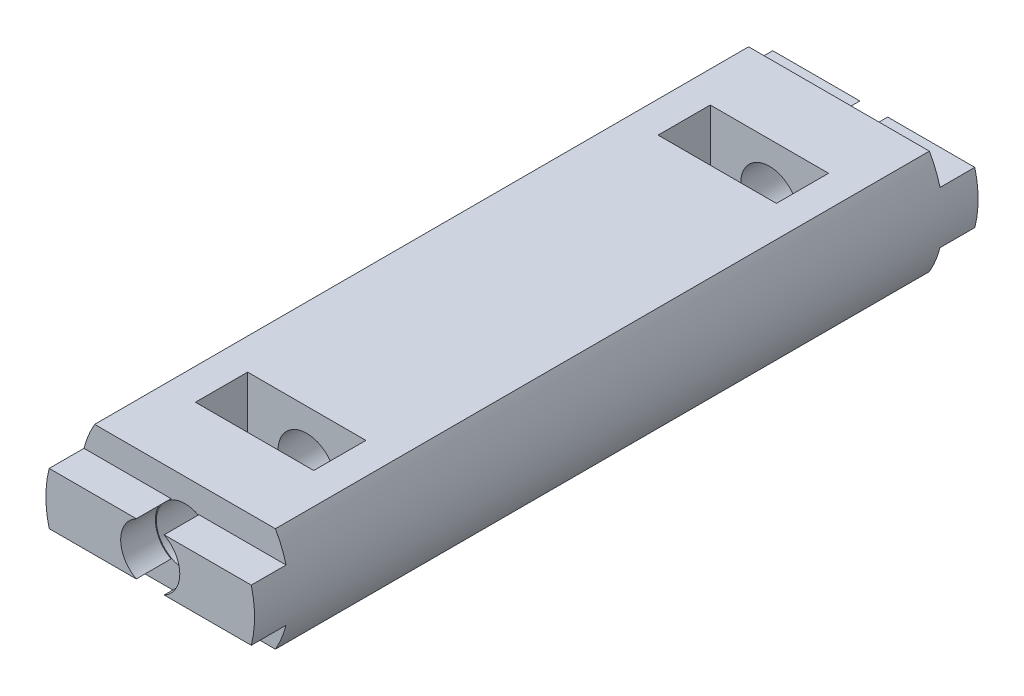
ISO-10303-21;
HEADER;
FILE_DESCRIPTION(('STEP AP214'),'2;1');
FILE_NAME('part.step','',(''),(''),'','','');
FILE_SCHEMA(('AUTOMOTIVE_DESIGN { 1 0 10303 214 1 1 1 1 }'));
ENDSEC;
DATA;
#1=APPLICATION_CONTEXT('core data for automotive mechanical design processes');
#2=APPLICATION_PROTOCOL_DEFINITION('international standard','automotive_design',2000,#1);
#3=PRODUCT_CONTEXT('',#1,'mechanical');
#4=PRODUCT('Part','Part','',(#3));
#5=PRODUCT_RELATED_PRODUCT_CATEGORY('part','',(#4));
#6=PRODUCT_DEFINITION_FORMATION('','',#4);
#7=PRODUCT_DEFINITION_CONTEXT('part definition',#1,'design');
#8=PRODUCT_DEFINITION('design','',#6,#7);
#9=PRODUCT_DEFINITION_SHAPE('','',#8);
#10=(LENGTH_UNIT() NAMED_UNIT(*) SI_UNIT(.MILLI.,.METRE.));
#11=(NAMED_UNIT(*) PLANE_ANGLE_UNIT() SI_UNIT($,.RADIAN.));
#12=(NAMED_UNIT(*) SI_UNIT($,.STERADIAN.) SOLID_ANGLE_UNIT());
#13=UNCERTAINTY_MEASURE_WITH_UNIT(LENGTH_MEASURE(1.E-05),#10,'distance_accuracy_value','');
#14=(GEOMETRIC_REPRESENTATION_CONTEXT(3) GLOBAL_UNCERTAINTY_ASSIGNED_CONTEXT((#13)) GLOBAL_UNIT_ASSIGNED_CONTEXT((#10,
#11,#12)) REPRESENTATION_CONTEXT('',''));
#15=CARTESIAN_POINT('',(0.,0.,0.));
#16=DIRECTION('',(0.,0.,1.));
#17=DIRECTION('',(1.,0.,0.));
#18=AXIS2_PLACEMENT_3D('',#15,#16,#17);
#19=CARTESIAN_POINT('',(-5.19615242270663,3.,37.6));
#20=DIRECTION('',(0.,-1.,0.));
#21=DIRECTION('',(0.,0.,-1.));
#22=AXIS2_PLACEMENT_3D('',#19,#20,#21);
#23=PLANE('',#22);
#24=DIRECTION('',(0.,0.,1.));
#25=VECTOR('',#24,1.);
#26=CARTESIAN_POINT('',(3.4,3.,0.));
#27=LINE('',#26,#25);
#28=CARTESIAN_POINT('',(3.4,3.,4.));
#29=VERTEX_POINT('',#28);
#30=CARTESIAN_POINT('',(3.4,3.,7.));
#31=VERTEX_POINT('',#30);
#32=EDGE_CURVE('E256',#29,#31,#27,.T.);
#33=ORIENTED_EDGE('',*,*,#32,.T.);
#34=DIRECTION('',(1.,0.,0.));
#35=VECTOR('',#34,1.);
#36=CARTESIAN_POINT('',(0.,3.,7.));
#37=LINE('',#36,#35);
#38=CARTESIAN_POINT('',(-3.4,3.,7.));
#39=VERTEX_POINT('',#38);
#40=EDGE_CURVE('E265',#39,#31,#37,.T.);
#41=ORIENTED_EDGE('',*,*,#40,.F.);
#42=DIRECTION('',(0.,0.,1.));
#43=VECTOR('',#42,1.);
#44=CARTESIAN_POINT('',(-3.4,3.,0.));
#45=LINE('',#44,#43);
#46=CARTESIAN_POINT('',(-3.4,3.,4.));
#47=VERTEX_POINT('',#46);
#48=EDGE_CURVE('E262',#47,#39,#45,.T.);
#49=ORIENTED_EDGE('',*,*,#48,.F.);
#50=DIRECTION('',(1.,0.,0.));
#51=VECTOR('',#50,1.);
#52=CARTESIAN_POINT('',(0.,3.,4.));
#53=LINE('',#52,#51);
#54=EDGE_CURVE('E259',#47,#29,#53,.T.);
#55=ORIENTED_EDGE('',*,*,#54,.T.);
#56=EDGE_LOOP('',(#33,#41,#49,#55));
#57=FACE_BOUND('',#56,.T.);
#58=DIRECTION('',(-1.,0.,0.));
#59=VECTOR('',#58,1.);
#60=CARTESIAN_POINT('',(-5.19615242270663,3.,0.));
#61=LINE('',#60,#59);
#62=CARTESIAN_POINT('',(5.19615242270663,3.,0.));
#63=VERTEX_POINT('',#62);
#64=CARTESIAN_POINT('',(-5.19615242270663,3.,0.));
#65=VERTEX_POINT('',#64);
#66=EDGE_CURVE('E416',#63,#65,#61,.T.);
#67=ORIENTED_EDGE('',*,*,#66,.T.);
#68=DIRECTION('',(0.,0.,-1.));
#69=VECTOR('',#68,1.);
#70=CARTESIAN_POINT('',(-5.19615242270663,3.,37.6));
#71=LINE('',#70,#69);
#72=CARTESIAN_POINT('',(-5.19615242270663,3.,37.6));
#73=VERTEX_POINT('',#72);
#74=EDGE_CURVE('E429',#73,#65,#71,.T.);
#75=ORIENTED_EDGE('',*,*,#74,.F.);
#76=DIRECTION('',(-1.,0.,0.));
#77=VECTOR('',#76,1.);
#78=CARTESIAN_POINT('',(-5.19615242270663,3.,37.6));
#79=LINE('',#78,#77);
#80=CARTESIAN_POINT('',(5.19615242270663,3.,37.6));
#81=VERTEX_POINT('',#80);
#82=EDGE_CURVE('E403',#81,#73,#79,.T.);
#83=ORIENTED_EDGE('',*,*,#82,.F.);
#84=DIRECTION('',(0.,0.,-1.));
#85=VECTOR('',#84,1.);
#86=CARTESIAN_POINT('',(5.19615242270663,3.,37.6));
#87=LINE('',#86,#85);
#88=EDGE_CURVE('E432',#81,#63,#87,.T.);
#89=ORIENTED_EDGE('',*,*,#88,.T.);
#90=EDGE_LOOP('',(#67,#75,#83,#89));
#91=FACE_BOUND('',#90,.T.);
#92=DIRECTION('',(0.,0.,-1.));
#93=VECTOR('',#92,1.);
#94=CARTESIAN_POINT('',(-3.39999999999993,3.,0.));
#95=LINE('',#94,#93);
#96=CARTESIAN_POINT('',(-3.4,3.,33.6));
#97=VERTEX_POINT('',#96);
#98=CARTESIAN_POINT('',(-3.39999999999999,3.,30.6));
#99=VERTEX_POINT('',#98);
#100=EDGE_CURVE('E52',#97,#99,#95,.T.);
#101=ORIENTED_EDGE('',*,*,#100,.T.);
#102=DIRECTION('',(-1.,0.,0.));
#103=VECTOR('',#102,1.);
#104=CARTESIAN_POINT('',(0.,3.,30.6));
#105=LINE('',#104,#103);
#106=CARTESIAN_POINT('',(3.4,3.,30.6));
#107=VERTEX_POINT('',#106);
#108=EDGE_CURVE('E238',#107,#99,#105,.T.);
#109=ORIENTED_EDGE('',*,*,#108,.F.);
#110=DIRECTION('',(0.,0.,-1.));
#111=VECTOR('',#110,1.);
#112=CARTESIAN_POINT('',(3.40000000000001,3.,0.));
#113=LINE('',#112,#111);
#114=CARTESIAN_POINT('',(3.4,3.,33.6));
#115=VERTEX_POINT('',#114);
#116=EDGE_CURVE('E225',#115,#107,#113,.T.);
#117=ORIENTED_EDGE('',*,*,#116,.F.);
#118=DIRECTION('',(-1.,0.,0.));
#119=VECTOR('',#118,1.);
#120=CARTESIAN_POINT('',(0.,3.,33.6));
#121=LINE('',#120,#119);
#122=EDGE_CURVE('E233',#115,#97,#121,.T.);
#123=ORIENTED_EDGE('',*,*,#122,.T.);
#124=EDGE_LOOP('',(#101,#109,#117,#123));
#125=FACE_BOUND('',#124,.T.);
#126=ADVANCED_FACE('F35',(#57,#91,#125),#23,.F.);
#127=CARTESIAN_POINT('',(-5.19615242270663,-3.,37.6));
#128=DIRECTION('',(0.,1.,0.));
#129=DIRECTION('',(0.,0.,1.));
#130=AXIS2_PLACEMENT_3D('',#127,#128,#129);
#131=PLANE('',#130);
#132=DIRECTION('',(0.,0.,1.));
#133=VECTOR('',#132,1.);
#134=CARTESIAN_POINT('',(3.4,-3.,0.));
#135=LINE('',#134,#133);
#136=CARTESIAN_POINT('',(3.4,-3.,4.));
#137=VERTEX_POINT('',#136);
#138=CARTESIAN_POINT('',(3.4,-3.,7.));
#139=VERTEX_POINT('',#138);
#140=EDGE_CURVE('E268',#137,#139,#135,.T.);
#141=ORIENTED_EDGE('',*,*,#140,.F.);
#142=DIRECTION('',(1.,0.,0.));
#143=VECTOR('',#142,1.);
#144=CARTESIAN_POINT('',(0.,-3.,4.));
#145=LINE('',#144,#143);
#146=CARTESIAN_POINT('',(-3.4,-3.,4.));
#147=VERTEX_POINT('',#146);
#148=EDGE_CURVE('E270',#147,#137,#145,.T.);
#149=ORIENTED_EDGE('',*,*,#148,.F.);
#150=DIRECTION('',(0.,0.,1.));
#151=VECTOR('',#150,1.);
#152=CARTESIAN_POINT('',(-3.4,-3.,0.));
#153=LINE('',#152,#151);
#154=CARTESIAN_POINT('',(-3.4,-3.,7.));
#155=VERTEX_POINT('',#154);
#156=EDGE_CURVE('E272',#147,#155,#153,.T.);
#157=ORIENTED_EDGE('',*,*,#156,.T.);
#158=DIRECTION('',(1.,0.,0.));
#159=VECTOR('',#158,1.);
#160=CARTESIAN_POINT('',(0.,-3.,7.));
#161=LINE('',#160,#159);
#162=EDGE_CURVE('E275',#155,#139,#161,.T.);
#163=ORIENTED_EDGE('',*,*,#162,.T.);
#164=EDGE_LOOP('',(#141,#149,#157,#163));
#165=FACE_BOUND('',#164,.T.);
#166=DIRECTION('',(1.,0.,0.));
#167=VECTOR('',#166,1.);
#168=CARTESIAN_POINT('',(-5.19615242270663,-3.,0.));
#169=LINE('',#168,#167);
#170=CARTESIAN_POINT('',(-5.19615242270663,-3.,0.));
#171=VERTEX_POINT('',#170);
#172=CARTESIAN_POINT('',(5.19615242270663,-3.,0.));
#173=VERTEX_POINT('',#172);
#174=EDGE_CURVE('E422',#171,#173,#169,.T.);
#175=ORIENTED_EDGE('',*,*,#174,.T.);
#176=DIRECTION('',(0.,0.,-1.));
#177=VECTOR('',#176,1.);
#178=CARTESIAN_POINT('',(5.19615242270663,-3.,37.6));
#179=LINE('',#178,#177);
#180=CARTESIAN_POINT('',(5.19615242270663,-3.,37.6));
#181=VERTEX_POINT('',#180);
#182=EDGE_CURVE('E412',#181,#173,#179,.T.);
#183=ORIENTED_EDGE('',*,*,#182,.F.);
#184=DIRECTION('',(1.,0.,0.));
#185=VECTOR('',#184,1.);
#186=CARTESIAN_POINT('',(-5.19615242270663,-3.,37.6));
#187=LINE('',#186,#185);
#188=CARTESIAN_POINT('',(-5.19615242270663,-3.,37.6));
#189=VERTEX_POINT('',#188);
#190=EDGE_CURVE('E410',#189,#181,#187,.T.);
#191=ORIENTED_EDGE('',*,*,#190,.F.);
#192=DIRECTION('',(0.,0.,-1.));
#193=VECTOR('',#192,1.);
#194=CARTESIAN_POINT('',(-5.19615242270663,-3.,37.6));
#195=LINE('',#194,#193);
#196=EDGE_CURVE('E426',#189,#171,#195,.T.);
#197=ORIENTED_EDGE('',*,*,#196,.T.);
#198=EDGE_LOOP('',(#175,#183,#191,#197));
#199=FACE_BOUND('',#198,.T.);
#200=DIRECTION('',(0.,0.,-1.));
#201=VECTOR('',#200,1.);
#202=CARTESIAN_POINT('',(-3.39999999999993,-3.,0.));
#203=LINE('',#202,#201);
#204=CARTESIAN_POINT('',(-3.4,-3.,33.6));
#205=VERTEX_POINT('',#204);
#206=CARTESIAN_POINT('',(-3.39999999999999,-3.,30.6));
#207=VERTEX_POINT('',#206);
#208=EDGE_CURVE('E240',#205,#207,#203,.T.);
#209=ORIENTED_EDGE('',*,*,#208,.F.);
#210=DIRECTION('',(-1.,0.,0.));
#211=VECTOR('',#210,1.);
#212=CARTESIAN_POINT('',(0.,-3.,33.6));
#213=LINE('',#212,#211);
#214=CARTESIAN_POINT('',(3.4,-3.,33.6));
#215=VERTEX_POINT('',#214);
#216=EDGE_CURVE('E245',#215,#205,#213,.T.);
#217=ORIENTED_EDGE('',*,*,#216,.F.);
#218=DIRECTION('',(0.,0.,-1.));
#219=VECTOR('',#218,1.);
#220=CARTESIAN_POINT('',(3.40000000000001,-3.,0.));
#221=LINE('',#220,#219);
#222=CARTESIAN_POINT('',(3.4,-3.,30.6));
#223=VERTEX_POINT('',#222);
#224=EDGE_CURVE('E60',#215,#223,#221,.T.);
#225=ORIENTED_EDGE('',*,*,#224,.T.);
#226=DIRECTION('',(-1.,0.,0.));
#227=VECTOR('',#226,1.);
#228=CARTESIAN_POINT('',(0.,-3.,30.6));
#229=LINE('',#228,#227);
#230=EDGE_CURVE('E248',#223,#207,#229,.T.);
#231=ORIENTED_EDGE('',*,*,#230,.T.);
#232=EDGE_LOOP('',(#209,#217,#225,#231));
#233=FACE_BOUND('',#232,.T.);
#234=ADVANCED_FACE('F471',(#165,#199,#233),#131,.F.);
#235=CARTESIAN_POINT('',(0.,0.,37.6));
#236=DIRECTION('',(0.,0.,-1.));
#237=DIRECTION('',(-1.,0.,0.));
#238=AXIS2_PLACEMENT_3D('',#235,#236,#237);
#239=CYLINDRICAL_SURFACE('',#238,1.65);
#240=CARTESIAN_POINT('',(0.,0.,37.6));
#241=DIRECTION('',(0.,0.,1.));
#242=DIRECTION('',(1.,0.,0.));
#243=AXIS2_PLACEMENT_3D('',#240,#241,#242);
#244=CIRCLE('',#243,1.65);
#245=CARTESIAN_POINT('',(1.65,0.,37.6));
#246=VERTEX_POINT('',#245);
#247=EDGE_CURVE('E394',#246,#246,#244,.T.);
#248=ORIENTED_EDGE('',*,*,#247,.T.);
#249=EDGE_LOOP('',(#248));
#250=FACE_BOUND('',#249,.T.);
#251=CARTESIAN_POINT('',(0.,0.,33.6));
#252=DIRECTION('',(0.,0.,-1.));
#253=DIRECTION('',(-1.,0.,0.));
#254=AXIS2_PLACEMENT_3D('',#251,#252,#253);
#255=CIRCLE('',#254,1.65);
#256=CARTESIAN_POINT('',(-1.65,0.,33.6));
#257=VERTEX_POINT('',#256);
#258=EDGE_CURVE('E253',#257,#257,#255,.T.);
#259=ORIENTED_EDGE('',*,*,#258,.T.);
#260=EDGE_LOOP('',(#259));
#261=FACE_BOUND('',#260,.T.);
#262=ADVANCED_FACE('F455',(#250,#261),#239,.F.);
#263=CARTESIAN_POINT('',(0.,0.,0.));
#264=DIRECTION('',(0.,0.,1.));
#265=DIRECTION('',(1.,0.,0.));
#266=AXIS2_PLACEMENT_3D('',#263,#264,#265);
#267=CIRCLE('',#266,1.65);
#268=CARTESIAN_POINT('',(1.65,0.,0.));
#269=VERTEX_POINT('',#268);
#270=EDGE_CURVE('E393',#269,#269,#267,.T.);
#271=ORIENTED_EDGE('',*,*,#270,.F.);
#272=EDGE_LOOP('',(#271));
#273=FACE_BOUND('',#272,.T.);
#274=CARTESIAN_POINT('',(0.,0.,4.));
#275=DIRECTION('',(0.,0.,1.));
#276=DIRECTION('',(1.,0.,0.));
#277=AXIS2_PLACEMENT_3D('',#274,#275,#276);
#278=CIRCLE('',#277,1.65);
#279=CARTESIAN_POINT('',(1.65,0.,4.));
#280=VERTEX_POINT('',#279);
#281=EDGE_CURVE('E281',#280,#280,#278,.T.);
#282=ORIENTED_EDGE('',*,*,#281,.T.);
#283=EDGE_LOOP('',(#282));
#284=FACE_BOUND('',#283,.T.);
#285=ADVANCED_FACE('F456',(#273,#284),#239,.F.);
#286=CARTESIAN_POINT('',(0.,0.,37.6));
#287=DIRECTION('',(0.,0.,1.));
#288=DIRECTION('',(1.,0.,0.));
#289=AXIS2_PLACEMENT_3D('',#286,#287,#288);
#290=PLANE('',#289);
#291=ORIENTED_EDGE('',*,*,#247,.F.);
#292=EDGE_LOOP('',(#291));
#293=FACE_BOUND('',#292,.T.);
#294=CARTESIAN_POINT('',(0.,0.,37.6));
#295=DIRECTION('',(0.,0.,1.));
#296=DIRECTION('',(1.,0.,0.));
#297=AXIS2_PLACEMENT_3D('',#294,#295,#296);
#298=CIRCLE('',#297,6.);
#299=CARTESIAN_POINT('',(-5.80947501931113,1.5,37.6));
#300=VERTEX_POINT('',#299);
#301=EDGE_CURVE('E407',#73,#300,#298,.T.);
#302=ORIENTED_EDGE('',*,*,#301,.T.);
#303=DIRECTION('',(1.,0.,0.));
#304=VECTOR('',#303,1.);
#305=CARTESIAN_POINT('',(0.,1.5,37.6));
#306=LINE('',#305,#304);
#307=CARTESIAN_POINT('',(-0.799999999999997,1.5,37.6));
#308=VERTEX_POINT('',#307);
#309=EDGE_CURVE('E335',#300,#308,#306,.T.);
#310=ORIENTED_EDGE('',*,*,#309,.T.);
#311=CARTESIAN_POINT('',(0.,0.,37.6));
#312=DIRECTION('',(0.,0.,1.));
#313=DIRECTION('',(1.,0.,0.));
#314=AXIS2_PLACEMENT_3D('',#311,#312,#313);
#315=CIRCLE('',#314,1.7);
#316=CARTESIAN_POINT('',(-0.799999999999997,-1.5,37.6));
#317=VERTEX_POINT('',#316);
#318=EDGE_CURVE('E338',#308,#317,#315,.T.);
#319=ORIENTED_EDGE('',*,*,#318,.T.);
#320=DIRECTION('',(-1.,0.,0.));
#321=VECTOR('',#320,1.);
#322=CARTESIAN_POINT('',(0.,-1.5,37.6));
#323=LINE('',#322,#321);
#324=CARTESIAN_POINT('',(-5.80947501931113,-1.5,37.6));
#325=VERTEX_POINT('',#324);
#326=EDGE_CURVE('E329',#317,#325,#323,.T.);
#327=ORIENTED_EDGE('',*,*,#326,.T.);
#328=EDGE_CURVE('E406',#325,#189,#298,.T.);
#329=ORIENTED_EDGE('',*,*,#328,.T.);
#330=ORIENTED_EDGE('',*,*,#190,.T.);
#331=CARTESIAN_POINT('',(0.,0.,37.6));
#332=DIRECTION('',(0.,0.,1.));
#333=DIRECTION('',(1.,0.,0.));
#334=AXIS2_PLACEMENT_3D('',#331,#332,#333);
#335=CIRCLE('',#334,6.);
#336=CARTESIAN_POINT('',(5.80947501931113,-1.5,37.6));
#337=VERTEX_POINT('',#336);
#338=EDGE_CURVE('E400',#181,#337,#335,.T.);
#339=ORIENTED_EDGE('',*,*,#338,.T.);
#340=DIRECTION('',(-1.,0.,0.));
#341=VECTOR('',#340,1.);
#342=CARTESIAN_POINT('',(0.,-1.5,37.6));
#343=LINE('',#342,#341);
#344=CARTESIAN_POINT('',(0.799999999999997,-1.5,37.6));
#345=VERTEX_POINT('',#344);
#346=EDGE_CURVE('E381',#337,#345,#343,.T.);
#347=ORIENTED_EDGE('',*,*,#346,.T.);
#348=CARTESIAN_POINT('',(0.,0.,37.6));
#349=DIRECTION('',(0.,0.,1.));
#350=DIRECTION('',(1.,0.,0.));
#351=AXIS2_PLACEMENT_3D('',#348,#349,#350);
#352=CIRCLE('',#351,1.7);
#353=CARTESIAN_POINT('',(0.799999999999998,1.5,37.6));
#354=VERTEX_POINT('',#353);
#355=EDGE_CURVE('E390',#345,#354,#352,.T.);
#356=ORIENTED_EDGE('',*,*,#355,.T.);
#357=DIRECTION('',(1.,0.,0.));
#358=VECTOR('',#357,1.);
#359=CARTESIAN_POINT('',(0.,1.5,37.6));
#360=LINE('',#359,#358);
#361=CARTESIAN_POINT('',(5.80947501931113,1.5,37.6));
#362=VERTEX_POINT('',#361);
#363=EDGE_CURVE('E387',#354,#362,#360,.T.);
#364=ORIENTED_EDGE('',*,*,#363,.T.);
#365=EDGE_CURVE('E404',#362,#81,#335,.T.);
#366=ORIENTED_EDGE('',*,*,#365,.T.);
#367=ORIENTED_EDGE('',*,*,#82,.T.);
#368=EDGE_LOOP('',(#302,#310,#319,#327,#329,#330,#339,#347,#356,#364,#366,#367));
#369=FACE_BOUND('',#368,.T.);
#370=ADVANCED_FACE('F505',(#293,#369),#290,.T.);
#371=CARTESIAN_POINT('',(0.,0.,0.));
#372=DIRECTION('',(0.,0.,1.));
#373=DIRECTION('',(1.,0.,0.));
#374=AXIS2_PLACEMENT_3D('',#371,#372,#373);
#375=PLANE('',#374);
#376=ORIENTED_EDGE('',*,*,#270,.T.);
#377=EDGE_LOOP('',(#376));
#378=FACE_BOUND('',#377,.T.);
#379=DIRECTION('',(1.,0.,0.));
#380=VECTOR('',#379,1.);
#381=CARTESIAN_POINT('',(0.,1.5,0.));
#382=LINE('',#381,#380);
#383=CARTESIAN_POINT('',(-5.80947501931113,1.5,0.));
#384=VERTEX_POINT('',#383);
#385=CARTESIAN_POINT('',(-0.799999999999997,1.5,0.));
#386=VERTEX_POINT('',#385);
#387=EDGE_CURVE('E332',#384,#386,#382,.T.);
#388=ORIENTED_EDGE('',*,*,#387,.F.);
#389=CARTESIAN_POINT('',(0.,0.,0.));
#390=DIRECTION('',(0.,0.,1.));
#391=DIRECTION('',(1.,0.,0.));
#392=AXIS2_PLACEMENT_3D('',#389,#390,#391);
#393=CIRCLE('',#392,6.);
#394=EDGE_CURVE('E419',#65,#384,#393,.T.);
#395=ORIENTED_EDGE('',*,*,#394,.F.);
#396=ORIENTED_EDGE('',*,*,#66,.F.);
#397=CARTESIAN_POINT('',(0.,0.,0.));
#398=DIRECTION('',(0.,0.,1.));
#399=DIRECTION('',(1.,0.,0.));
#400=AXIS2_PLACEMENT_3D('',#397,#398,#399);
#401=CIRCLE('',#400,6.);
#402=CARTESIAN_POINT('',(5.80947501931113,1.5,0.));
#403=VERTEX_POINT('',#402);
#404=EDGE_CURVE('E397',#403,#63,#401,.T.);
#405=ORIENTED_EDGE('',*,*,#404,.F.);
#406=DIRECTION('',(1.,0.,0.));
#407=VECTOR('',#406,1.);
#408=CARTESIAN_POINT('',(0.,1.5,0.));
#409=LINE('',#408,#407);
#410=CARTESIAN_POINT('',(0.799999999999998,1.5,0.));
#411=VERTEX_POINT('',#410);
#412=EDGE_CURVE('E384',#411,#403,#409,.T.);
#413=ORIENTED_EDGE('',*,*,#412,.F.);
#414=CARTESIAN_POINT('',(0.,0.,0.));
#415=DIRECTION('',(0.,0.,1.));
#416=DIRECTION('',(1.,0.,0.));
#417=AXIS2_PLACEMENT_3D('',#414,#415,#416);
#418=CIRCLE('',#417,1.7);
#419=CARTESIAN_POINT('',(0.799999999999998,-1.5,0.));
#420=VERTEX_POINT('',#419);
#421=EDGE_CURVE('E44',#420,#411,#418,.T.);
#422=ORIENTED_EDGE('',*,*,#421,.F.);
#423=DIRECTION('',(-1.,0.,0.));
#424=VECTOR('',#423,1.);
#425=CARTESIAN_POINT('',(0.,-1.5,0.));
#426=LINE('',#425,#424);
#427=CARTESIAN_POINT('',(5.80947501931113,-1.5,0.));
#428=VERTEX_POINT('',#427);
#429=EDGE_CURVE('E378',#428,#420,#426,.T.);
#430=ORIENTED_EDGE('',*,*,#429,.F.);
#431=EDGE_CURVE('E413',#173,#428,#401,.T.);
#432=ORIENTED_EDGE('',*,*,#431,.F.);
#433=ORIENTED_EDGE('',*,*,#174,.F.);
#434=CARTESIAN_POINT('',(-5.80947501931113,-1.5,0.));
#435=VERTEX_POINT('',#434);
#436=EDGE_CURVE('E418',#435,#171,#393,.T.);
#437=ORIENTED_EDGE('',*,*,#436,.F.);
#438=DIRECTION('',(-1.,0.,0.));
#439=VECTOR('',#438,1.);
#440=CARTESIAN_POINT('',(0.,-1.5,0.));
#441=LINE('',#440,#439);
#442=CARTESIAN_POINT('',(-0.799999999999997,-1.5,0.));
#443=VERTEX_POINT('',#442);
#444=EDGE_CURVE('E326',#443,#435,#441,.T.);
#445=ORIENTED_EDGE('',*,*,#444,.F.);
#446=CARTESIAN_POINT('',(0.,0.,0.));
#447=DIRECTION('',(0.,0.,1.));
#448=DIRECTION('',(1.,0.,0.));
#449=AXIS2_PLACEMENT_3D('',#446,#447,#448);
#450=CIRCLE('',#449,1.7);
#451=EDGE_CURVE('E12',#386,#443,#450,.T.);
#452=ORIENTED_EDGE('',*,*,#451,.F.);
#453=EDGE_LOOP('',(#388,#395,#396,#405,#413,#422,#430,#432,#433,#437,#445,#452));
#454=FACE_BOUND('',#453,.T.);
#455=ADVANCED_FACE('F502',(#378,#454),#375,.F.);
#456=CARTESIAN_POINT('',(0.,0.,37.6));
#457=DIRECTION('',(0.,0.,-1.));
#458=DIRECTION('',(-1.,0.,0.));
#459=AXIS2_PLACEMENT_3D('',#456,#457,#458);
#460=CYLINDRICAL_SURFACE('',#459,6.);
#461=ORIENTED_EDGE('',*,*,#431,.T.);
#462=DIRECTION('',(0.,0.,1.));
#463=VECTOR('',#462,1.);
#464=CARTESIAN_POINT('',(5.80947501931113,-1.5,-2.));
#465=LINE('',#464,#463);
#466=CARTESIAN_POINT('',(5.80947501931113,-1.5,-2.));
#467=VERTEX_POINT('',#466);
#468=EDGE_CURVE('E367',#467,#428,#465,.T.);
#469=ORIENTED_EDGE('',*,*,#468,.F.);
#470=CARTESIAN_POINT('',(0.,0.,-2.));
#471=DIRECTION('',(0.,0.,-1.));
#472=DIRECTION('',(-1.,0.,0.));
#473=AXIS2_PLACEMENT_3D('',#470,#471,#472);
#474=CIRCLE('',#473,6.);
#475=CARTESIAN_POINT('',(5.80947501931113,1.5,-2.));
#476=VERTEX_POINT('',#475);
#477=EDGE_CURVE('E358',#476,#467,#474,.T.);
#478=ORIENTED_EDGE('',*,*,#477,.F.);
#479=DIRECTION('',(0.,0.,1.));
#480=VECTOR('',#479,1.);
#481=CARTESIAN_POINT('',(5.80947501931113,1.5,-2.));
#482=LINE('',#481,#480);
#483=EDGE_CURVE('E371',#476,#403,#482,.T.);
#484=ORIENTED_EDGE('',*,*,#483,.T.);
#485=ORIENTED_EDGE('',*,*,#404,.T.);
#486=ORIENTED_EDGE('',*,*,#88,.F.);
#487=ORIENTED_EDGE('',*,*,#365,.F.);
#488=CARTESIAN_POINT('',(5.80947501931113,1.5,39.6));
#489=VERTEX_POINT('',#488);
#490=EDGE_CURVE('E370',#362,#489,#482,.T.);
#491=ORIENTED_EDGE('',*,*,#490,.T.);
#492=CARTESIAN_POINT('',(0.,0.,39.6));
#493=DIRECTION('',(0.,0.,1.));
#494=DIRECTION('',(1.,0.,0.));
#495=AXIS2_PLACEMENT_3D('',#492,#493,#494);
#496=CIRCLE('',#495,6.);
#497=CARTESIAN_POINT('',(5.80947501931113,-1.5,39.6));
#498=VERTEX_POINT('',#497);
#499=EDGE_CURVE('E344',#489,#498,#496,.F.);
#500=ORIENTED_EDGE('',*,*,#499,.T.);
#501=EDGE_CURVE('E366',#337,#498,#465,.T.);
#502=ORIENTED_EDGE('',*,*,#501,.F.);
#503=ORIENTED_EDGE('',*,*,#338,.F.);
#504=ORIENTED_EDGE('',*,*,#182,.T.);
#505=EDGE_LOOP('',(#461,#469,#478,#484,#485,#486,#487,#491,#500,#502,#503,#504));
#506=FACE_BOUND('',#505,.T.);
#507=ADVANCED_FACE('F37',(#506),#460,.T.);
#508=CARTESIAN_POINT('',(0.,0.,37.6));
#509=DIRECTION('',(0.,0.,-1.));
#510=DIRECTION('',(-1.,0.,0.));
#511=AXIS2_PLACEMENT_3D('',#508,#509,#510);
#512=CYLINDRICAL_SURFACE('',#511,6.);
#513=ORIENTED_EDGE('',*,*,#328,.F.);
#514=DIRECTION('',(0.,0.,1.));
#515=VECTOR('',#514,1.);
#516=CARTESIAN_POINT('',(-5.80947501931113,-1.5,-2.));
#517=LINE('',#516,#515);
#518=CARTESIAN_POINT('',(-5.80947501931113,-1.5,39.6));
#519=VERTEX_POINT('',#518);
#520=EDGE_CURVE('E310',#325,#519,#517,.T.);
#521=ORIENTED_EDGE('',*,*,#520,.T.);
#522=CARTESIAN_POINT('',(0.,0.,39.6));
#523=DIRECTION('',(0.,0.,1.));
#524=DIRECTION('',(1.,0.,0.));
#525=AXIS2_PLACEMENT_3D('',#522,#523,#524);
#526=CIRCLE('',#525,6.);
#527=CARTESIAN_POINT('',(-5.80947501931113,1.5,39.6));
#528=VERTEX_POINT('',#527);
#529=EDGE_CURVE('E293',#519,#528,#526,.F.);
#530=ORIENTED_EDGE('',*,*,#529,.T.);
#531=DIRECTION('',(0.,0.,1.));
#532=VECTOR('',#531,1.);
#533=CARTESIAN_POINT('',(-5.80947501931113,1.5,-2.));
#534=LINE('',#533,#532);
#535=EDGE_CURVE('E322',#300,#528,#534,.T.);
#536=ORIENTED_EDGE('',*,*,#535,.F.);
#537=ORIENTED_EDGE('',*,*,#301,.F.);
#538=ORIENTED_EDGE('',*,*,#74,.T.);
#539=ORIENTED_EDGE('',*,*,#394,.T.);
#540=CARTESIAN_POINT('',(-5.80947501931113,1.5,-2.));
#541=VERTEX_POINT('',#540);
#542=EDGE_CURVE('E323',#541,#384,#534,.T.);
#543=ORIENTED_EDGE('',*,*,#542,.F.);
#544=CARTESIAN_POINT('',(0.,0.,-2.));
#545=DIRECTION('',(0.,0.,-1.));
#546=DIRECTION('',(-1.,0.,0.));
#547=AXIS2_PLACEMENT_3D('',#544,#545,#546);
#548=CIRCLE('',#547,6.);
#549=CARTESIAN_POINT('',(-5.80947501931113,-1.5,-2.));
#550=VERTEX_POINT('',#549);
#551=EDGE_CURVE('E296',#550,#541,#548,.T.);
#552=ORIENTED_EDGE('',*,*,#551,.F.);
#553=EDGE_CURVE('E311',#550,#435,#517,.T.);
#554=ORIENTED_EDGE('',*,*,#553,.T.);
#555=ORIENTED_EDGE('',*,*,#436,.T.);
#556=ORIENTED_EDGE('',*,*,#196,.F.);
#557=EDGE_LOOP('',(#513,#521,#530,#536,#537,#538,#539,#543,#552,#554,#555,#556));
#558=FACE_BOUND('',#557,.T.);
#559=ADVANCED_FACE('F453',(#558),#512,.T.);
#560=CARTESIAN_POINT('',(0.,0.,30.6));
#561=DIRECTION('',(0.,0.,-1.));
#562=DIRECTION('',(-1.,0.,0.));
#563=AXIS2_PLACEMENT_3D('',#560,#561,#562);
#564=CIRCLE('',#563,1.65);
#565=CARTESIAN_POINT('',(-1.65,0.,30.6));
#566=VERTEX_POINT('',#565);
#567=EDGE_CURVE('E39',#566,#566,#564,.T.);
#568=ORIENTED_EDGE('',*,*,#567,.F.);
#569=EDGE_LOOP('',(#568));
#570=FACE_BOUND('',#569,.T.);
#571=CARTESIAN_POINT('',(0.,0.,7.));
#572=DIRECTION('',(0.,0.,1.));
#573=DIRECTION('',(1.,0.,0.));
#574=AXIS2_PLACEMENT_3D('',#571,#572,#573);
#575=CIRCLE('',#574,1.65);
#576=CARTESIAN_POINT('',(1.65,0.,7.));
#577=VERTEX_POINT('',#576);
#578=EDGE_CURVE('E292',#577,#577,#575,.T.);
#579=ORIENTED_EDGE('',*,*,#578,.F.);
#580=EDGE_LOOP('',(#579));
#581=FACE_BOUND('',#580,.T.);
#582=ADVANCED_FACE('F449',(#570,#581),#239,.F.);
#583=CARTESIAN_POINT('',(0.,0.,-2.));
#584=DIRECTION('',(0.,0.,-1.));
#585=DIRECTION('',(-1.,0.,0.));
#586=AXIS2_PLACEMENT_3D('',#583,#584,#585);
#587=PLANE('',#586);
#588=CARTESIAN_POINT('',(0.,0.,-2.));
#589=DIRECTION('',(0.,0.,1.));
#590=DIRECTION('',(-1.,0.,0.));
#591=AXIS2_PLACEMENT_3D('',#588,#589,#590);
#592=CIRCLE('',#591,1.7);
#593=CARTESIAN_POINT('',(0.799999999999998,-1.5,-2.));
#594=VERTEX_POINT('',#593);
#595=CARTESIAN_POINT('',(0.799999999999998,1.5,-2.));
#596=VERTEX_POINT('',#595);
#597=EDGE_CURVE('E348',#594,#596,#592,.T.);
#598=ORIENTED_EDGE('',*,*,#597,.T.);
#599=DIRECTION('',(1.,0.,0.));
#600=VECTOR('',#599,1.);
#601=CARTESIAN_POINT('',(5.80947501931113,1.5,-2.));
#602=LINE('',#601,#600);
#603=EDGE_CURVE('E356',#596,#476,#602,.T.);
#604=ORIENTED_EDGE('',*,*,#603,.T.);
#605=ORIENTED_EDGE('',*,*,#477,.T.);
#606=DIRECTION('',(-1.,0.,0.));
#607=VECTOR('',#606,1.);
#608=CARTESIAN_POINT('',(5.80947501931113,-1.5,-2.));
#609=LINE('',#608,#607);
#610=EDGE_CURVE('E360',#467,#594,#609,.T.);
#611=ORIENTED_EDGE('',*,*,#610,.T.);
#612=EDGE_LOOP('',(#598,#604,#605,#611));
#613=FACE_BOUND('',#612,.T.);
#614=ADVANCED_FACE('F452',(#613),#587,.T.);
#615=CARTESIAN_POINT('',(5.80947501931113,-1.5,-2.));
#616=DIRECTION('',(0.,1.,0.));
#617=DIRECTION('',(0.,0.,1.));
#618=AXIS2_PLACEMENT_3D('',#615,#616,#617);
#619=PLANE('',#618);
#620=ORIENTED_EDGE('',*,*,#468,.T.);
#621=ORIENTED_EDGE('',*,*,#429,.T.);
#622=DIRECTION('',(0.,0.,1.));
#623=VECTOR('',#622,1.);
#624=CARTESIAN_POINT('',(0.799999999999998,-1.5,-2.));
#625=LINE('',#624,#623);
#626=EDGE_CURVE('E363',#594,#420,#625,.T.);
#627=ORIENTED_EDGE('',*,*,#626,.F.);
#628=ORIENTED_EDGE('',*,*,#610,.F.);
#629=EDGE_LOOP('',(#620,#621,#627,#628));
#630=FACE_BOUND('',#629,.T.);
#631=ADVANCED_FACE('F525',(#630),#619,.F.);
#632=CARTESIAN_POINT('',(5.80947501931113,1.5,-2.));
#633=DIRECTION('',(0.,-1.,0.));
#634=DIRECTION('',(1.,0.,0.));
#635=AXIS2_PLACEMENT_3D('',#632,#633,#634);
#636=PLANE('',#635);
#637=DIRECTION('',(0.,0.,1.));
#638=VECTOR('',#637,1.);
#639=CARTESIAN_POINT('',(0.799999999999998,1.5,-2.));
#640=LINE('',#639,#638);
#641=EDGE_CURVE('E375',#596,#411,#640,.T.);
#642=ORIENTED_EDGE('',*,*,#641,.T.);
#643=ORIENTED_EDGE('',*,*,#412,.T.);
#644=ORIENTED_EDGE('',*,*,#483,.F.);
#645=ORIENTED_EDGE('',*,*,#603,.F.);
#646=EDGE_LOOP('',(#642,#643,#644,#645));
#647=FACE_BOUND('',#646,.T.);
#648=ADVANCED_FACE('F520',(#647),#636,.F.);
#649=CARTESIAN_POINT('',(0.,0.,-2.));
#650=DIRECTION('',(0.,0.,1.));
#651=DIRECTION('',(1.,0.,0.));
#652=AXIS2_PLACEMENT_3D('',#649,#650,#651);
#653=CYLINDRICAL_SURFACE('',#652,1.7);
#654=ORIENTED_EDGE('',*,*,#626,.T.);
#655=ORIENTED_EDGE('',*,*,#421,.T.);
#656=ORIENTED_EDGE('',*,*,#641,.F.);
#657=ORIENTED_EDGE('',*,*,#597,.F.);
#658=EDGE_LOOP('',(#654,#655,#656,#657));
#659=FACE_BOUND('',#658,.T.);
#660=ADVANCED_FACE('F514',(#659),#653,.F.);
#661=ORIENTED_EDGE('',*,*,#355,.F.);
#662=CARTESIAN_POINT('',(0.799999999999997,-1.5,39.6));
#663=VERTEX_POINT('',#662);
#664=EDGE_CURVE('E362',#345,#663,#625,.T.);
#665=ORIENTED_EDGE('',*,*,#664,.T.);
#666=CARTESIAN_POINT('',(0.,0.,39.6));
#667=DIRECTION('',(0.,0.,1.));
#668=DIRECTION('',(1.,0.,0.));
#669=AXIS2_PLACEMENT_3D('',#666,#667,#668);
#670=CIRCLE('',#669,1.7);
#671=CARTESIAN_POINT('',(0.799999999999998,1.5,39.6));
#672=VERTEX_POINT('',#671);
#673=EDGE_CURVE('E345',#663,#672,#670,.T.);
#674=ORIENTED_EDGE('',*,*,#673,.T.);
#675=EDGE_CURVE('E374',#354,#672,#640,.T.);
#676=ORIENTED_EDGE('',*,*,#675,.F.);
#677=EDGE_LOOP('',(#661,#665,#674,#676));
#678=FACE_BOUND('',#677,.T.);
#679=ADVANCED_FACE('F510',(#678),#653,.F.);
#680=ORIENTED_EDGE('',*,*,#363,.F.);
#681=ORIENTED_EDGE('',*,*,#675,.T.);
#682=DIRECTION('',(1.,0.,0.));
#683=VECTOR('',#682,1.);
#684=CARTESIAN_POINT('',(5.80947501931113,1.5,39.6));
#685=LINE('',#684,#683);
#686=EDGE_CURVE('E341',#672,#489,#685,.T.);
#687=ORIENTED_EDGE('',*,*,#686,.T.);
#688=ORIENTED_EDGE('',*,*,#490,.F.);
#689=EDGE_LOOP('',(#680,#681,#687,#688));
#690=FACE_BOUND('',#689,.T.);
#691=ADVANCED_FACE('F513',(#690),#636,.F.);
#692=ORIENTED_EDGE('',*,*,#346,.F.);
#693=ORIENTED_EDGE('',*,*,#501,.T.);
#694=DIRECTION('',(-1.,0.,0.));
#695=VECTOR('',#694,1.);
#696=CARTESIAN_POINT('',(5.80947501931113,-1.5,39.6));
#697=LINE('',#696,#695);
#698=EDGE_CURVE('E349',#498,#663,#697,.T.);
#699=ORIENTED_EDGE('',*,*,#698,.T.);
#700=ORIENTED_EDGE('',*,*,#664,.F.);
#701=EDGE_LOOP('',(#692,#693,#699,#700));
#702=FACE_BOUND('',#701,.T.);
#703=ADVANCED_FACE('F518',(#702),#619,.F.);
#704=CARTESIAN_POINT('',(0.,0.,39.6));
#705=DIRECTION('',(0.,0.,1.));
#706=DIRECTION('',(1.,0.,0.));
#707=AXIS2_PLACEMENT_3D('',#704,#705,#706);
#708=PLANE('',#707);
#709=ORIENTED_EDGE('',*,*,#673,.F.);
#710=ORIENTED_EDGE('',*,*,#698,.F.);
#711=ORIENTED_EDGE('',*,*,#499,.F.);
#712=ORIENTED_EDGE('',*,*,#686,.F.);
#713=EDGE_LOOP('',(#709,#710,#711,#712));
#714=FACE_BOUND('',#713,.T.);
#715=ADVANCED_FACE('F523',(#714),#708,.T.);
#716=CARTESIAN_POINT('',(0.,0.,-2.));
#717=DIRECTION('',(0.,0.,-1.));
#718=DIRECTION('',(-1.,0.,0.));
#719=AXIS2_PLACEMENT_3D('',#716,#717,#718);
#720=PLANE('',#719);
#721=ORIENTED_EDGE('',*,*,#551,.T.);
#722=DIRECTION('',(1.,0.,0.));
#723=VECTOR('',#722,1.);
#724=CARTESIAN_POINT('',(-0.799999999999997,1.5,-2.));
#725=LINE('',#724,#723);
#726=CARTESIAN_POINT('',(-0.799999999999997,1.5,-2.));
#727=VERTEX_POINT('',#726);
#728=EDGE_CURVE('E304',#541,#727,#725,.T.);
#729=ORIENTED_EDGE('',*,*,#728,.T.);
#730=CARTESIAN_POINT('',(0.,0.,-2.));
#731=DIRECTION('',(0.,0.,1.));
#732=DIRECTION('',(-1.,0.,0.));
#733=AXIS2_PLACEMENT_3D('',#730,#731,#732);
#734=CIRCLE('',#733,1.7);
#735=CARTESIAN_POINT('',(-0.799999999999997,-1.5,-2.));
#736=VERTEX_POINT('',#735);
#737=EDGE_CURVE('E306',#727,#736,#734,.T.);
#738=ORIENTED_EDGE('',*,*,#737,.T.);
#739=DIRECTION('',(-1.,0.,0.));
#740=VECTOR('',#739,1.);
#741=CARTESIAN_POINT('',(-0.799999999999998,-1.5,-2.));
#742=LINE('',#741,#740);
#743=EDGE_CURVE('E308',#736,#550,#742,.T.);
#744=ORIENTED_EDGE('',*,*,#743,.T.);
#745=EDGE_LOOP('',(#721,#729,#738,#744));
#746=FACE_BOUND('',#745,.T.);
#747=ADVANCED_FACE('F531',(#746),#720,.T.);
#748=CARTESIAN_POINT('',(-0.799999999999998,-1.5,-2.));
#749=DIRECTION('',(0.,1.,0.));
#750=DIRECTION('',(-1.,0.,0.));
#751=AXIS2_PLACEMENT_3D('',#748,#749,#750);
#752=PLANE('',#751);
#753=DIRECTION('',(0.,0.,1.));
#754=VECTOR('',#753,1.);
#755=CARTESIAN_POINT('',(-0.799999999999997,-1.5,-2.));
#756=LINE('',#755,#754);
#757=EDGE_CURVE('E315',#736,#443,#756,.T.);
#758=ORIENTED_EDGE('',*,*,#757,.T.);
#759=ORIENTED_EDGE('',*,*,#444,.T.);
#760=ORIENTED_EDGE('',*,*,#553,.F.);
#761=ORIENTED_EDGE('',*,*,#743,.F.);
#762=EDGE_LOOP('',(#758,#759,#760,#761));
#763=FACE_BOUND('',#762,.T.);
#764=ADVANCED_FACE('F546',(#763),#752,.F.);
#765=CARTESIAN_POINT('',(0.,0.,-2.));
#766=DIRECTION('',(0.,0.,1.));
#767=DIRECTION('',(1.,0.,0.));
#768=AXIS2_PLACEMENT_3D('',#765,#766,#767);
#769=CYLINDRICAL_SURFACE('',#768,1.7);
#770=DIRECTION('',(0.,0.,1.));
#771=VECTOR('',#770,1.);
#772=CARTESIAN_POINT('',(-0.799999999999997,1.5,-2.));
#773=LINE('',#772,#771);
#774=EDGE_CURVE('E319',#727,#386,#773,.T.);
#775=ORIENTED_EDGE('',*,*,#774,.T.);
#776=ORIENTED_EDGE('',*,*,#451,.T.);
#777=ORIENTED_EDGE('',*,*,#757,.F.);
#778=ORIENTED_EDGE('',*,*,#737,.F.);
#779=EDGE_LOOP('',(#775,#776,#777,#778));
#780=FACE_BOUND('',#779,.T.);
#781=ADVANCED_FACE('F542',(#780),#769,.F.);
#782=CARTESIAN_POINT('',(-0.799999999999997,1.5,-2.));
#783=DIRECTION('',(0.,-1.,0.));
#784=DIRECTION('',(1.,0.,0.));
#785=AXIS2_PLACEMENT_3D('',#782,#783,#784);
#786=PLANE('',#785);
#787=ORIENTED_EDGE('',*,*,#542,.T.);
#788=ORIENTED_EDGE('',*,*,#387,.T.);
#789=ORIENTED_EDGE('',*,*,#774,.F.);
#790=ORIENTED_EDGE('',*,*,#728,.F.);
#791=EDGE_LOOP('',(#787,#788,#789,#790));
#792=FACE_BOUND('',#791,.T.);
#793=ADVANCED_FACE('F537',(#792),#786,.F.);
#794=ORIENTED_EDGE('',*,*,#309,.F.);
#795=ORIENTED_EDGE('',*,*,#535,.T.);
#796=DIRECTION('',(1.,0.,0.));
#797=VECTOR('',#796,1.);
#798=CARTESIAN_POINT('',(-0.799999999999997,1.5,39.6));
#799=LINE('',#798,#797);
#800=CARTESIAN_POINT('',(-0.799999999999997,1.5,39.6));
#801=VERTEX_POINT('',#800);
#802=EDGE_CURVE('E288',#528,#801,#799,.T.);
#803=ORIENTED_EDGE('',*,*,#802,.T.);
#804=EDGE_CURVE('E318',#308,#801,#773,.T.);
#805=ORIENTED_EDGE('',*,*,#804,.F.);
#806=EDGE_LOOP('',(#794,#795,#803,#805));
#807=FACE_BOUND('',#806,.T.);
#808=ADVANCED_FACE('F533',(#807),#786,.F.);
#809=ORIENTED_EDGE('',*,*,#318,.F.);
#810=ORIENTED_EDGE('',*,*,#804,.T.);
#811=CARTESIAN_POINT('',(0.,0.,39.6));
#812=DIRECTION('',(0.,0.,1.));
#813=DIRECTION('',(1.,0.,0.));
#814=AXIS2_PLACEMENT_3D('',#811,#812,#813);
#815=CIRCLE('',#814,1.7);
#816=CARTESIAN_POINT('',(-0.799999999999997,-1.5,39.6));
#817=VERTEX_POINT('',#816);
#818=EDGE_CURVE('E291',#801,#817,#815,.T.);
#819=ORIENTED_EDGE('',*,*,#818,.T.);
#820=EDGE_CURVE('E314',#317,#817,#756,.T.);
#821=ORIENTED_EDGE('',*,*,#820,.F.);
#822=EDGE_LOOP('',(#809,#810,#819,#821));
#823=FACE_BOUND('',#822,.T.);
#824=ADVANCED_FACE('F536',(#823),#769,.F.);
#825=ORIENTED_EDGE('',*,*,#326,.F.);
#826=ORIENTED_EDGE('',*,*,#820,.T.);
#827=DIRECTION('',(-1.,0.,0.));
#828=VECTOR('',#827,1.);
#829=CARTESIAN_POINT('',(-0.799999999999998,-1.5,39.6));
#830=LINE('',#829,#828);
#831=EDGE_CURVE('E297',#817,#519,#830,.T.);
#832=ORIENTED_EDGE('',*,*,#831,.T.);
#833=ORIENTED_EDGE('',*,*,#520,.F.);
#834=EDGE_LOOP('',(#825,#826,#832,#833));
#835=FACE_BOUND('',#834,.T.);
#836=ADVANCED_FACE('F489',(#835),#752,.F.);
#837=CARTESIAN_POINT('',(0.,0.,39.6));
#838=DIRECTION('',(0.,0.,1.));
#839=DIRECTION('',(1.,0.,0.));
#840=AXIS2_PLACEMENT_3D('',#837,#838,#839);
#841=PLANE('',#840);
#842=ORIENTED_EDGE('',*,*,#529,.F.);
#843=ORIENTED_EDGE('',*,*,#831,.F.);
#844=ORIENTED_EDGE('',*,*,#818,.F.);
#845=ORIENTED_EDGE('',*,*,#802,.F.);
#846=EDGE_LOOP('',(#842,#843,#844,#845));
#847=FACE_BOUND('',#846,.T.);
#848=ADVANCED_FACE('F484',(#847),#841,.T.);
#849=CARTESIAN_POINT('',(3.4,-3.,0.));
#850=DIRECTION('',(-1.,0.,0.));
#851=DIRECTION('',(0.,0.,1.));
#852=AXIS2_PLACEMENT_3D('',#849,#850,#851);
#853=PLANE('',#852);
#854=DIRECTION('',(0.,1.,0.));
#855=VECTOR('',#854,1.);
#856=CARTESIAN_POINT('',(3.4,-3.,4.));
#857=LINE('',#856,#855);
#858=EDGE_CURVE('E278',#137,#29,#857,.T.);
#859=ORIENTED_EDGE('',*,*,#858,.F.);
#860=ORIENTED_EDGE('',*,*,#140,.T.);
#861=DIRECTION('',(0.,1.,0.));
#862=VECTOR('',#861,1.);
#863=CARTESIAN_POINT('',(3.4,-3.,7.));
#864=LINE('',#863,#862);
#865=EDGE_CURVE('E279',#139,#31,#864,.T.);
#866=ORIENTED_EDGE('',*,*,#865,.T.);
#867=ORIENTED_EDGE('',*,*,#32,.F.);
#868=EDGE_LOOP('',(#859,#860,#866,#867));
#869=FACE_BOUND('',#868,.T.);
#870=ADVANCED_FACE('F463',(#869),#853,.T.);
#871=CARTESIAN_POINT('',(0.,-3.,7.));
#872=DIRECTION('',(0.,0.,1.));
#873=DIRECTION('',(1.,0.,0.));
#874=AXIS2_PLACEMENT_3D('',#871,#872,#873);
#875=PLANE('',#874);
#876=ORIENTED_EDGE('',*,*,#578,.T.);
#877=EDGE_LOOP('',(#876));
#878=FACE_BOUND('',#877,.T.);
#879=ORIENTED_EDGE('',*,*,#865,.F.);
#880=ORIENTED_EDGE('',*,*,#162,.F.);
#881=DIRECTION('',(0.,1.,0.));
#882=VECTOR('',#881,1.);
#883=CARTESIAN_POINT('',(-3.4,-3.,7.));
#884=LINE('',#883,#882);
#885=EDGE_CURVE('E282',#155,#39,#884,.T.);
#886=ORIENTED_EDGE('',*,*,#885,.T.);
#887=ORIENTED_EDGE('',*,*,#40,.T.);
#888=EDGE_LOOP('',(#879,#880,#886,#887));
#889=FACE_BOUND('',#888,.T.);
#890=ADVANCED_FACE('F459',(#878,#889),#875,.F.);
#891=CARTESIAN_POINT('',(-3.4,-3.,0.));
#892=DIRECTION('',(-1.,0.,0.));
#893=DIRECTION('',(0.,0.,1.));
#894=AXIS2_PLACEMENT_3D('',#891,#892,#893);
#895=PLANE('',#894);
#896=ORIENTED_EDGE('',*,*,#885,.F.);
#897=ORIENTED_EDGE('',*,*,#156,.F.);
#898=DIRECTION('',(0.,1.,0.));
#899=VECTOR('',#898,1.);
#900=CARTESIAN_POINT('',(-3.4,-3.,4.));
#901=LINE('',#900,#899);
#902=EDGE_CURVE('E284',#147,#47,#901,.T.);
#903=ORIENTED_EDGE('',*,*,#902,.T.);
#904=ORIENTED_EDGE('',*,*,#48,.T.);
#905=EDGE_LOOP('',(#896,#897,#903,#904));
#906=FACE_BOUND('',#905,.T.);
#907=ADVANCED_FACE('F462',(#906),#895,.F.);
#908=CARTESIAN_POINT('',(0.,-3.,4.));
#909=DIRECTION('',(0.,0.,1.));
#910=DIRECTION('',(1.,0.,0.));
#911=AXIS2_PLACEMENT_3D('',#908,#909,#910);
#912=PLANE('',#911);
#913=ORIENTED_EDGE('',*,*,#281,.F.);
#914=EDGE_LOOP('',(#913));
#915=FACE_BOUND('',#914,.T.);
#916=ORIENTED_EDGE('',*,*,#902,.F.);
#917=ORIENTED_EDGE('',*,*,#148,.T.);
#918=ORIENTED_EDGE('',*,*,#858,.T.);
#919=ORIENTED_EDGE('',*,*,#54,.F.);
#920=EDGE_LOOP('',(#916,#917,#918,#919));
#921=FACE_BOUND('',#920,.T.);
#922=ADVANCED_FACE('F478',(#915,#921),#912,.T.);
#923=CARTESIAN_POINT('',(-3.39999999999993,-3.,0.));
#924=DIRECTION('',(1.,0.,0.));
#925=DIRECTION('',(0.,0.,-1.));
#926=AXIS2_PLACEMENT_3D('',#923,#924,#925);
#927=PLANE('',#926);
#928=DIRECTION('',(0.,1.,0.));
#929=VECTOR('',#928,1.);
#930=CARTESIAN_POINT('',(-3.4,-3.,33.6));
#931=LINE('',#930,#929);
#932=EDGE_CURVE('E230',#205,#97,#931,.T.);
#933=ORIENTED_EDGE('',*,*,#932,.F.);
#934=ORIENTED_EDGE('',*,*,#208,.T.);
#935=DIRECTION('',(0.,1.,0.));
#936=VECTOR('',#935,1.);
#937=CARTESIAN_POINT('',(-3.39999999999999,-3.,30.6));
#938=LINE('',#937,#936);
#939=EDGE_CURVE('E251',#207,#99,#938,.T.);
#940=ORIENTED_EDGE('',*,*,#939,.T.);
#941=ORIENTED_EDGE('',*,*,#100,.F.);
#942=EDGE_LOOP('',(#933,#934,#940,#941));
#943=FACE_BOUND('',#942,.T.);
#944=ADVANCED_FACE('F778',(#943),#927,.T.);
#945=CARTESIAN_POINT('',(0.,-3.,30.6));
#946=DIRECTION('',(0.,0.,-1.));
#947=DIRECTION('',(-1.,0.,0.));
#948=AXIS2_PLACEMENT_3D('',#945,#946,#947);
#949=PLANE('',#948);
#950=ORIENTED_EDGE('',*,*,#567,.T.);
#951=EDGE_LOOP('',(#950));
#952=FACE_BOUND('',#951,.T.);
#953=ORIENTED_EDGE('',*,*,#939,.F.);
#954=ORIENTED_EDGE('',*,*,#230,.F.);
#955=DIRECTION('',(0.,1.,0.));
#956=VECTOR('',#955,1.);
#957=CARTESIAN_POINT('',(3.4,-3.,30.6));
#958=LINE('',#957,#956);
#959=EDGE_CURVE('E229',#223,#107,#958,.T.);
#960=ORIENTED_EDGE('',*,*,#959,.T.);
#961=ORIENTED_EDGE('',*,*,#108,.T.);
#962=EDGE_LOOP('',(#953,#954,#960,#961));
#963=FACE_BOUND('',#962,.T.);
#964=ADVANCED_FACE('F446',(#952,#963),#949,.F.);
#965=CARTESIAN_POINT('',(3.40000000000001,-3.,0.));
#966=DIRECTION('',(1.,0.,0.));
#967=DIRECTION('',(0.,0.,-1.));
#968=AXIS2_PLACEMENT_3D('',#965,#966,#967);
#969=PLANE('',#968);
#970=ORIENTED_EDGE('',*,*,#959,.F.);
#971=ORIENTED_EDGE('',*,*,#224,.F.);
#972=DIRECTION('',(0.,1.,0.));
#973=VECTOR('',#972,1.);
#974=CARTESIAN_POINT('',(3.4,-3.,33.6));
#975=LINE('',#974,#973);
#976=EDGE_CURVE('E221',#215,#115,#975,.T.);
#977=ORIENTED_EDGE('',*,*,#976,.T.);
#978=ORIENTED_EDGE('',*,*,#116,.T.);
#979=EDGE_LOOP('',(#970,#971,#977,#978));
#980=FACE_BOUND('',#979,.T.);
#981=ADVANCED_FACE('F223',(#980),#969,.F.);
#982=CARTESIAN_POINT('',(0.,-3.,33.6));
#983=DIRECTION('',(0.,0.,-1.));
#984=DIRECTION('',(-1.,0.,0.));
#985=AXIS2_PLACEMENT_3D('',#982,#983,#984);
#986=PLANE('',#985);
#987=ORIENTED_EDGE('',*,*,#258,.F.);
#988=EDGE_LOOP('',(#987));
#989=FACE_BOUND('',#988,.T.);
#990=ORIENTED_EDGE('',*,*,#976,.F.);
#991=ORIENTED_EDGE('',*,*,#216,.T.);
#992=ORIENTED_EDGE('',*,*,#932,.T.);
#993=ORIENTED_EDGE('',*,*,#122,.F.);
#994=EDGE_LOOP('',(#990,#991,#992,#993));
#995=FACE_BOUND('',#994,.T.);
#996=ADVANCED_FACE('F234',(#989,#995),#986,.T.);
#997=CLOSED_SHELL('',(#126,#234,#262,#285,#370,#455,#507,#559,#582,#614,#631,#648,#660,#679,
#691,#703,#715,#747,#764,#781,#793,#808,#824,#836,#848,#870,#890,#907,#922,#944,#964,#981,#996));
#998=MANIFOLD_SOLID_BREP('B2',#997);
#999=ADVANCED_BREP_SHAPE_REPRESENTATION('',(#18,#998),#14);
#1000=SHAPE_DEFINITION_REPRESENTATION(#9,#999);
ENDSEC;
END-ISO-10303-21;
